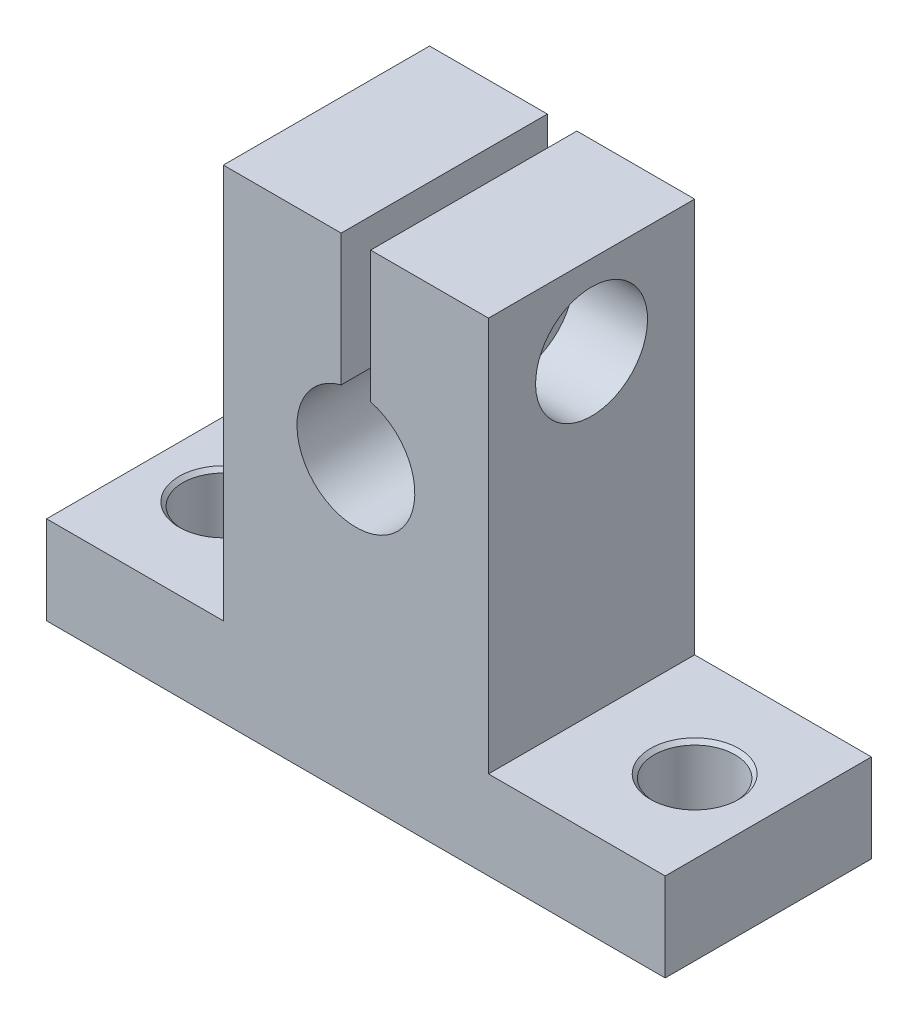
ISO-10303-21;
HEADER;
FILE_DESCRIPTION(('STEP AP214'),'2;1');
FILE_NAME('part.step','',(''),(''),'','','');
FILE_SCHEMA(('AUTOMOTIVE_DESIGN { 1 0 10303 214 1 1 1 1 }'));
ENDSEC;
DATA;
#1=APPLICATION_CONTEXT('core data for automotive mechanical design processes');
#2=APPLICATION_PROTOCOL_DEFINITION('international standard','automotive_design',2000,#1);
#3=PRODUCT_CONTEXT('',#1,'mechanical');
#4=PRODUCT('Part','Part','',(#3));
#5=PRODUCT_RELATED_PRODUCT_CATEGORY('part','',(#4));
#6=PRODUCT_DEFINITION_FORMATION('','',#4);
#7=PRODUCT_DEFINITION_CONTEXT('part definition',#1,'design');
#8=PRODUCT_DEFINITION('design','',#6,#7);
#9=PRODUCT_DEFINITION_SHAPE('','',#8);
#10=(LENGTH_UNIT() NAMED_UNIT(*) SI_UNIT(.MILLI.,.METRE.));
#11=(NAMED_UNIT(*) PLANE_ANGLE_UNIT() SI_UNIT($,.RADIAN.));
#12=(NAMED_UNIT(*) SI_UNIT($,.STERADIAN.) SOLID_ANGLE_UNIT());
#13=UNCERTAINTY_MEASURE_WITH_UNIT(LENGTH_MEASURE(1.E-05),#10,'distance_accuracy_value','');
#14=(GEOMETRIC_REPRESENTATION_CONTEXT(3) GLOBAL_UNCERTAINTY_ASSIGNED_CONTEXT((#13)) GLOBAL_UNIT_ASSIGNED_CONTEXT((#10,
#11,#12)) REPRESENTATION_CONTEXT('',''));
#15=CARTESIAN_POINT('',(0.,0.,0.));
#16=DIRECTION('',(0.,0.,1.));
#17=DIRECTION('',(1.,0.,0.));
#18=AXIS2_PLACEMENT_3D('',#15,#16,#17);
#19=CARTESIAN_POINT('',(-4.93969696196699,10.9364916731037,0.));
#20=DIRECTION('',(1.,0.,0.));
#21=DIRECTION('',(0.,1.,0.));
#22=AXIS2_PLACEMENT_3D('',#19,#20,#21);
#23=CYLINDRICAL_SURFACE('',#22,2.1);
#24=CARTESIAN_POINT('',(1.,10.9364916731037,0.));
#25=DIRECTION('',(1.,0.,0.));
#26=DIRECTION('',(0.,1.,0.));
#27=AXIS2_PLACEMENT_3D('',#24,#25,#26);
#28=CIRCLE('',#27,2.1);
#29=CARTESIAN_POINT('',(1.,13.0364916731037,0.));
#30=VERTEX_POINT('',#29);
#31=EDGE_CURVE('E212',#30,#30,#28,.F.);
#32=ORIENTED_EDGE('',*,*,#31,.T.);
#33=EDGE_LOOP('',(#32));
#34=FACE_BOUND('',#33,.T.);
#35=CARTESIAN_POINT('',(4.,10.9364916731037,0.));
#36=DIRECTION('',(1.,0.,0.));
#37=DIRECTION('',(0.,1.,0.));
#38=AXIS2_PLACEMENT_3D('',#35,#36,#37);
#39=CIRCLE('',#38,2.1);
#40=CARTESIAN_POINT('',(4.,13.0364916731037,0.));
#41=VERTEX_POINT('',#40);
#42=EDGE_CURVE('E209',#41,#41,#39,.F.);
#43=ORIENTED_EDGE('',*,*,#42,.F.);
#44=EDGE_LOOP('',(#43));
#45=FACE_BOUND('',#44,.T.);
#46=ADVANCED_FACE('F36',(#34,#45),#23,.F.);
#47=CARTESIAN_POINT('',(-9.,-10.4,7.));
#48=DIRECTION('',(1.,0.,0.));
#49=DIRECTION('',(0.,1.,0.));
#50=AXIS2_PLACEMENT_3D('',#47,#48,#49);
#51=PLANE('',#50);
#52=CARTESIAN_POINT('',(-9.,10.9364916731037,0.));
#53=DIRECTION('',(1.,0.,0.));
#54=DIRECTION('',(0.,1.,0.));
#55=AXIS2_PLACEMENT_3D('',#52,#53,#54);
#56=CIRCLE('',#55,1.9);
#57=CARTESIAN_POINT('',(-9.,12.8364916731037,0.));
#58=VERTEX_POINT('',#57);
#59=EDGE_CURVE('E11',#58,#58,#56,.T.);
#60=ORIENTED_EDGE('',*,*,#59,.T.);
#61=EDGE_LOOP('',(#60));
#62=FACE_BOUND('',#61,.T.);
#63=DIRECTION('',(0.,-1.,0.));
#64=VECTOR('',#63,1.);
#65=CARTESIAN_POINT('',(-9.,-10.4,-7.));
#66=LINE('',#65,#64);
#67=CARTESIAN_POINT('',(-9.,16.4,-7.));
#68=VERTEX_POINT('',#67);
#69=CARTESIAN_POINT('',(-9.,-10.4,-7.));
#70=VERTEX_POINT('',#69);
#71=EDGE_CURVE('E158',#68,#70,#66,.T.);
#72=ORIENTED_EDGE('',*,*,#71,.T.);
#73=DIRECTION('',(0.,0.,-1.));
#74=VECTOR('',#73,1.);
#75=CARTESIAN_POINT('',(-9.,-10.4,7.));
#76=LINE('',#75,#74);
#77=CARTESIAN_POINT('',(-9.,-10.4,7.));
#78=VERTEX_POINT('',#77);
#79=EDGE_CURVE('E206',#78,#70,#76,.T.);
#80=ORIENTED_EDGE('',*,*,#79,.F.);
#81=DIRECTION('',(0.,-1.,0.));
#82=VECTOR('',#81,1.);
#83=CARTESIAN_POINT('',(-9.,-10.4,7.));
#84=LINE('',#83,#82);
#85=CARTESIAN_POINT('',(-9.,16.4,7.));
#86=VERTEX_POINT('',#85);
#87=EDGE_CURVE('E181',#86,#78,#84,.T.);
#88=ORIENTED_EDGE('',*,*,#87,.F.);
#89=DIRECTION('',(0.,0.,-1.));
#90=VECTOR('',#89,1.);
#91=CARTESIAN_POINT('',(-9.,16.4,7.));
#92=LINE('',#91,#90);
#93=EDGE_CURVE('E154',#86,#68,#92,.T.);
#94=ORIENTED_EDGE('',*,*,#93,.T.);
#95=EDGE_LOOP('',(#72,#80,#88,#94));
#96=FACE_BOUND('',#95,.T.);
#97=ADVANCED_FACE('F240',(#62,#96),#51,.F.);
#98=CARTESIAN_POINT('',(-21.,-10.4,7.));
#99=DIRECTION('',(0.,-1.,0.));
#100=DIRECTION('',(0.,0.,-1.));
#101=AXIS2_PLACEMENT_3D('',#98,#99,#100);
#102=PLANE('',#101);
#103=CARTESIAN_POINT('',(-16.,-10.4,0.));
#104=DIRECTION('',(0.,-1.,0.));
#105=DIRECTION('',(0.,0.,-1.));
#106=AXIS2_PLACEMENT_3D('',#103,#104,#105);
#107=CIRCLE('',#106,3.00000000000003);
#108=CARTESIAN_POINT('',(-16.,-10.4,-3.00000000000003));
#109=VERTEX_POINT('',#108);
#110=EDGE_CURVE('E222',#109,#109,#107,.T.);
#111=ORIENTED_EDGE('',*,*,#110,.T.);
#112=EDGE_LOOP('',(#111));
#113=FACE_BOUND('',#112,.T.);
#114=DIRECTION('',(-1.,0.,0.));
#115=VECTOR('',#114,1.);
#116=CARTESIAN_POINT('',(-21.,-10.4,-7.));
#117=LINE('',#116,#115);
#118=CARTESIAN_POINT('',(-21.,-10.4,-7.));
#119=VERTEX_POINT('',#118);
#120=EDGE_CURVE('E161',#70,#119,#117,.T.);
#121=ORIENTED_EDGE('',*,*,#120,.T.);
#122=DIRECTION('',(0.,0.,-1.));
#123=VECTOR('',#122,1.);
#124=CARTESIAN_POINT('',(-21.,-10.4,7.));
#125=LINE('',#124,#123);
#126=CARTESIAN_POINT('',(-21.,-10.4,7.));
#127=VERTEX_POINT('',#126);
#128=EDGE_CURVE('E203',#127,#119,#125,.T.);
#129=ORIENTED_EDGE('',*,*,#128,.F.);
#130=DIRECTION('',(-1.,0.,0.));
#131=VECTOR('',#130,1.);
#132=CARTESIAN_POINT('',(-21.,-10.4,7.));
#133=LINE('',#132,#131);
#134=EDGE_CURVE('E109',#78,#127,#133,.T.);
#135=ORIENTED_EDGE('',*,*,#134,.F.);
#136=ORIENTED_EDGE('',*,*,#79,.T.);
#137=EDGE_LOOP('',(#121,#129,#135,#136));
#138=FACE_BOUND('',#137,.T.);
#139=ADVANCED_FACE('F246',(#113,#138),#102,.F.);
#140=CARTESIAN_POINT('',(-21.,-16.4,7.));
#141=DIRECTION('',(1.,0.,0.));
#142=DIRECTION('',(0.,0.,-1.));
#143=AXIS2_PLACEMENT_3D('',#140,#141,#142);
#144=PLANE('',#143);
#145=DIRECTION('',(0.,-1.,0.));
#146=VECTOR('',#145,1.);
#147=CARTESIAN_POINT('',(-21.,-16.4,-7.));
#148=LINE('',#147,#146);
#149=CARTESIAN_POINT('',(-21.,-16.4,-7.));
#150=VERTEX_POINT('',#149);
#151=EDGE_CURVE('E164',#119,#150,#148,.T.);
#152=ORIENTED_EDGE('',*,*,#151,.T.);
#153=DIRECTION('',(0.,0.,-1.));
#154=VECTOR('',#153,1.);
#155=CARTESIAN_POINT('',(-21.,-16.4,7.));
#156=LINE('',#155,#154);
#157=CARTESIAN_POINT('',(-21.,-16.4,7.));
#158=VERTEX_POINT('',#157);
#159=EDGE_CURVE('E200',#158,#150,#156,.T.);
#160=ORIENTED_EDGE('',*,*,#159,.F.);
#161=DIRECTION('',(0.,-1.,0.));
#162=VECTOR('',#161,1.);
#163=CARTESIAN_POINT('',(-21.,-16.4,7.));
#164=LINE('',#163,#162);
#165=EDGE_CURVE('E334',#127,#158,#164,.T.);
#166=ORIENTED_EDGE('',*,*,#165,.F.);
#167=ORIENTED_EDGE('',*,*,#128,.T.);
#168=EDGE_LOOP('',(#152,#160,#166,#167));
#169=FACE_BOUND('',#168,.T.);
#170=ADVANCED_FACE('F303',(#169),#144,.F.);
#171=CARTESIAN_POINT('',(21.,-16.4,7.));
#172=DIRECTION('',(0.,1.,0.));
#173=DIRECTION('',(-1.,0.,0.));
#174=AXIS2_PLACEMENT_3D('',#171,#172,#173);
#175=PLANE('',#174);
#176=CARTESIAN_POINT('',(16.,-16.4,0.));
#177=DIRECTION('',(0.,1.,0.));
#178=DIRECTION('',(-1.,0.,0.));
#179=AXIS2_PLACEMENT_3D('',#176,#177,#178);
#180=CIRCLE('',#179,2.75);
#181=CARTESIAN_POINT('',(13.25,-16.4,0.));
#182=VERTEX_POINT('',#181);
#183=EDGE_CURVE('E323',#182,#182,#180,.F.);
#184=ORIENTED_EDGE('',*,*,#183,.F.);
#185=EDGE_LOOP('',(#184));
#186=FACE_BOUND('',#185,.T.);
#187=CARTESIAN_POINT('',(-16.,-16.4,0.));
#188=DIRECTION('',(0.,1.,0.));
#189=DIRECTION('',(-1.,0.,0.));
#190=AXIS2_PLACEMENT_3D('',#187,#188,#189);
#191=CIRCLE('',#190,2.75);
#192=CARTESIAN_POINT('',(-18.75,-16.4,0.));
#193=VERTEX_POINT('',#192);
#194=EDGE_CURVE('E162',#193,#193,#191,.F.);
#195=ORIENTED_EDGE('',*,*,#194,.F.);
#196=EDGE_LOOP('',(#195));
#197=FACE_BOUND('',#196,.T.);
#198=DIRECTION('',(1.,0.,0.));
#199=VECTOR('',#198,1.);
#200=CARTESIAN_POINT('',(21.,-16.4,-7.));
#201=LINE('',#200,#199);
#202=CARTESIAN_POINT('',(21.,-16.4,-7.));
#203=VERTEX_POINT('',#202);
#204=EDGE_CURVE('E166',#150,#203,#201,.T.);
#205=ORIENTED_EDGE('',*,*,#204,.T.);
#206=DIRECTION('',(0.,0.,-1.));
#207=VECTOR('',#206,1.);
#208=CARTESIAN_POINT('',(21.,-16.4,7.));
#209=LINE('',#208,#207);
#210=CARTESIAN_POINT('',(21.,-16.4,7.));
#211=VERTEX_POINT('',#210);
#212=EDGE_CURVE('E197',#211,#203,#209,.T.);
#213=ORIENTED_EDGE('',*,*,#212,.F.);
#214=DIRECTION('',(1.,0.,0.));
#215=VECTOR('',#214,1.);
#216=CARTESIAN_POINT('',(21.,-16.4,7.));
#217=LINE('',#216,#215);
#218=EDGE_CURVE('E336',#158,#211,#217,.T.);
#219=ORIENTED_EDGE('',*,*,#218,.F.);
#220=ORIENTED_EDGE('',*,*,#159,.T.);
#221=EDGE_LOOP('',(#205,#213,#219,#220));
#222=FACE_BOUND('',#221,.T.);
#223=ADVANCED_FACE('F299',(#186,#197,#222),#175,.F.);
#224=CARTESIAN_POINT('',(21.,-10.4,7.));
#225=DIRECTION('',(-1.,0.,0.));
#226=DIRECTION('',(0.,0.,1.));
#227=AXIS2_PLACEMENT_3D('',#224,#225,#226);
#228=PLANE('',#227);
#229=DIRECTION('',(0.,1.,0.));
#230=VECTOR('',#229,1.);
#231=CARTESIAN_POINT('',(21.,-10.4,-7.));
#232=LINE('',#231,#230);
#233=CARTESIAN_POINT('',(21.,-10.4,-7.));
#234=VERTEX_POINT('',#233);
#235=EDGE_CURVE('E168',#203,#234,#232,.T.);
#236=ORIENTED_EDGE('',*,*,#235,.T.);
#237=DIRECTION('',(0.,0.,-1.));
#238=VECTOR('',#237,1.);
#239=CARTESIAN_POINT('',(21.,-10.4,7.));
#240=LINE('',#239,#238);
#241=CARTESIAN_POINT('',(21.,-10.4,7.));
#242=VERTEX_POINT('',#241);
#243=EDGE_CURVE('E194',#242,#234,#240,.T.);
#244=ORIENTED_EDGE('',*,*,#243,.F.);
#245=DIRECTION('',(0.,1.,0.));
#246=VECTOR('',#245,1.);
#247=CARTESIAN_POINT('',(21.,-10.4,7.));
#248=LINE('',#247,#246);
#249=EDGE_CURVE('E338',#211,#242,#248,.T.);
#250=ORIENTED_EDGE('',*,*,#249,.F.);
#251=ORIENTED_EDGE('',*,*,#212,.T.);
#252=EDGE_LOOP('',(#236,#244,#250,#251));
#253=FACE_BOUND('',#252,.T.);
#254=ADVANCED_FACE('F295',(#253),#228,.F.);
#255=CARTESIAN_POINT('',(9.,-10.4,7.));
#256=DIRECTION('',(0.,-1.,0.));
#257=DIRECTION('',(1.,0.,0.));
#258=AXIS2_PLACEMENT_3D('',#255,#256,#257);
#259=PLANE('',#258);
#260=CARTESIAN_POINT('',(16.,-10.4,0.));
#261=DIRECTION('',(0.,-1.,0.));
#262=DIRECTION('',(1.,0.,0.));
#263=AXIS2_PLACEMENT_3D('',#260,#261,#262);
#264=CIRCLE('',#263,3.00000000000004);
#265=CARTESIAN_POINT('',(19.,-10.4,0.));
#266=VERTEX_POINT('',#265);
#267=EDGE_CURVE('E216',#266,#266,#264,.T.);
#268=ORIENTED_EDGE('',*,*,#267,.T.);
#269=EDGE_LOOP('',(#268));
#270=FACE_BOUND('',#269,.T.);
#271=DIRECTION('',(-1.,0.,0.));
#272=VECTOR('',#271,1.);
#273=CARTESIAN_POINT('',(9.,-10.4,-7.));
#274=LINE('',#273,#272);
#275=CARTESIAN_POINT('',(9.,-10.4,-7.));
#276=VERTEX_POINT('',#275);
#277=EDGE_CURVE('E170',#234,#276,#274,.T.);
#278=ORIENTED_EDGE('',*,*,#277,.T.);
#279=DIRECTION('',(0.,0.,-1.));
#280=VECTOR('',#279,1.);
#281=CARTESIAN_POINT('',(9.,-10.4,7.));
#282=LINE('',#281,#280);
#283=CARTESIAN_POINT('',(9.,-10.4,7.));
#284=VERTEX_POINT('',#283);
#285=EDGE_CURVE('E191',#284,#276,#282,.T.);
#286=ORIENTED_EDGE('',*,*,#285,.F.);
#287=DIRECTION('',(-1.,0.,0.));
#288=VECTOR('',#287,1.);
#289=CARTESIAN_POINT('',(9.,-10.4,7.));
#290=LINE('',#289,#288);
#291=EDGE_CURVE('E340',#242,#284,#290,.T.);
#292=ORIENTED_EDGE('',*,*,#291,.F.);
#293=ORIENTED_EDGE('',*,*,#243,.T.);
#294=EDGE_LOOP('',(#278,#286,#292,#293));
#295=FACE_BOUND('',#294,.T.);
#296=ADVANCED_FACE('F291',(#270,#295),#259,.F.);
#297=CARTESIAN_POINT('',(9.,16.4,7.));
#298=DIRECTION('',(-1.,0.,0.));
#299=DIRECTION('',(0.,-1.,0.));
#300=AXIS2_PLACEMENT_3D('',#297,#298,#299);
#301=PLANE('',#300);
#302=CARTESIAN_POINT('',(9.,10.9364916731037,0.));
#303=DIRECTION('',(1.,0.,0.));
#304=DIRECTION('',(0.,1.,0.));
#305=AXIS2_PLACEMENT_3D('',#302,#303,#304);
#306=CIRCLE('',#305,3.8);
#307=CARTESIAN_POINT('',(9.,14.7364916731037,0.));
#308=VERTEX_POINT('',#307);
#309=EDGE_CURVE('E373',#308,#308,#306,.T.);
#310=ORIENTED_EDGE('',*,*,#309,.F.);
#311=EDGE_LOOP('',(#310));
#312=FACE_BOUND('',#311,.T.);
#313=DIRECTION('',(0.,1.,0.));
#314=VECTOR('',#313,1.);
#315=CARTESIAN_POINT('',(9.,16.4,-7.));
#316=LINE('',#315,#314);
#317=CARTESIAN_POINT('',(9.,16.4,-7.));
#318=VERTEX_POINT('',#317);
#319=EDGE_CURVE('E172',#276,#318,#316,.T.);
#320=ORIENTED_EDGE('',*,*,#319,.T.);
#321=DIRECTION('',(0.,0.,-1.));
#322=VECTOR('',#321,1.);
#323=CARTESIAN_POINT('',(9.,16.4,7.));
#324=LINE('',#323,#322);
#325=CARTESIAN_POINT('',(9.,16.4,7.));
#326=VERTEX_POINT('',#325);
#327=EDGE_CURVE('E188',#326,#318,#324,.T.);
#328=ORIENTED_EDGE('',*,*,#327,.F.);
#329=DIRECTION('',(0.,1.,0.));
#330=VECTOR('',#329,1.);
#331=CARTESIAN_POINT('',(9.,16.4,7.));
#332=LINE('',#331,#330);
#333=EDGE_CURVE('E342',#284,#326,#332,.T.);
#334=ORIENTED_EDGE('',*,*,#333,.F.);
#335=ORIENTED_EDGE('',*,*,#285,.T.);
#336=EDGE_LOOP('',(#320,#328,#334,#335));
#337=FACE_BOUND('',#336,.T.);
#338=ADVANCED_FACE('F287',(#312,#337),#301,.F.);
#339=CARTESIAN_POINT('',(0.999999999999999,16.4,7.));
#340=DIRECTION('',(0.,-1.,0.));
#341=DIRECTION('',(1.,0.,0.));
#342=AXIS2_PLACEMENT_3D('',#339,#340,#341);
#343=PLANE('',#342);
#344=DIRECTION('',(-1.,0.,0.));
#345=VECTOR('',#344,1.);
#346=CARTESIAN_POINT('',(0.999999999999999,16.4,-7.));
#347=LINE('',#346,#345);
#348=CARTESIAN_POINT('',(0.999999999999999,16.4,-7.));
#349=VERTEX_POINT('',#348);
#350=EDGE_CURVE('E174',#318,#349,#347,.T.);
#351=ORIENTED_EDGE('',*,*,#350,.T.);
#352=DIRECTION('',(0.,0.,-1.));
#353=VECTOR('',#352,1.);
#354=CARTESIAN_POINT('',(0.999999999999999,16.4,7.));
#355=LINE('',#354,#353);
#356=CARTESIAN_POINT('',(0.999999999999999,16.4,7.));
#357=VERTEX_POINT('',#356);
#358=EDGE_CURVE('E185',#357,#349,#355,.T.);
#359=ORIENTED_EDGE('',*,*,#358,.F.);
#360=DIRECTION('',(-1.,0.,0.));
#361=VECTOR('',#360,1.);
#362=CARTESIAN_POINT('',(0.999999999999999,16.4,7.));
#363=LINE('',#362,#361);
#364=EDGE_CURVE('E344',#326,#357,#363,.T.);
#365=ORIENTED_EDGE('',*,*,#364,.F.);
#366=ORIENTED_EDGE('',*,*,#327,.T.);
#367=EDGE_LOOP('',(#351,#359,#365,#366));
#368=FACE_BOUND('',#367,.T.);
#369=ADVANCED_FACE('F283',(#368),#343,.F.);
#370=CARTESIAN_POINT('',(1.,7.47298334620742,7.));
#371=DIRECTION('',(1.,0.,0.));
#372=DIRECTION('',(0.,1.,0.));
#373=AXIS2_PLACEMENT_3D('',#370,#371,#372);
#374=PLANE('',#373);
#375=ORIENTED_EDGE('',*,*,#31,.F.);
#376=EDGE_LOOP('',(#375));
#377=FACE_BOUND('',#376,.T.);
#378=DIRECTION('',(0.,-1.,0.));
#379=VECTOR('',#378,1.);
#380=CARTESIAN_POINT('',(1.,7.47298334620742,-7.));
#381=LINE('',#380,#379);
#382=CARTESIAN_POINT('',(1.,7.47298334620742,-7.));
#383=VERTEX_POINT('',#382);
#384=EDGE_CURVE('E176',#349,#383,#381,.T.);
#385=ORIENTED_EDGE('',*,*,#384,.T.);
#386=DIRECTION('',(0.,0.,-1.));
#387=VECTOR('',#386,1.);
#388=CARTESIAN_POINT('',(1.,7.47298334620742,7.));
#389=LINE('',#388,#387);
#390=CARTESIAN_POINT('',(1.,7.47298334620742,7.));
#391=VERTEX_POINT('',#390);
#392=EDGE_CURVE('E149',#391,#383,#389,.T.);
#393=ORIENTED_EDGE('',*,*,#392,.F.);
#394=DIRECTION('',(0.,-1.,0.));
#395=VECTOR('',#394,1.);
#396=CARTESIAN_POINT('',(1.,7.47298334620742,7.));
#397=LINE('',#396,#395);
#398=EDGE_CURVE('E140',#357,#391,#397,.T.);
#399=ORIENTED_EDGE('',*,*,#398,.F.);
#400=ORIENTED_EDGE('',*,*,#358,.T.);
#401=EDGE_LOOP('',(#385,#393,#399,#400));
#402=FACE_BOUND('',#401,.T.);
#403=ADVANCED_FACE('F280',(#377,#402),#374,.F.);
#404=CARTESIAN_POINT('',(0.,3.6,7.));
#405=DIRECTION('',(0.,0.,-1.));
#406=DIRECTION('',(-1.,0.,0.));
#407=AXIS2_PLACEMENT_3D('',#404,#405,#406);
#408=CYLINDRICAL_SURFACE('',#407,4.);
#409=CARTESIAN_POINT('',(0.,3.6,-7.));
#410=DIRECTION('',(0.,0.,-1.));
#411=DIRECTION('',(1.,0.,0.));
#412=AXIS2_PLACEMENT_3D('',#409,#410,#411);
#413=CIRCLE('',#412,4.);
#414=CARTESIAN_POINT('',(-0.999999999999999,7.47298334620742,-7.));
#415=VERTEX_POINT('',#414);
#416=EDGE_CURVE('E148',#383,#415,#413,.T.);
#417=ORIENTED_EDGE('',*,*,#416,.T.);
#418=DIRECTION('',(0.,0.,-1.));
#419=VECTOR('',#418,1.);
#420=CARTESIAN_POINT('',(-0.999999999999999,7.47298334620742,7.));
#421=LINE('',#420,#419);
#422=CARTESIAN_POINT('',(-0.999999999999999,7.47298334620742,7.));
#423=VERTEX_POINT('',#422);
#424=EDGE_CURVE('E145',#423,#415,#421,.T.);
#425=ORIENTED_EDGE('',*,*,#424,.F.);
#426=CARTESIAN_POINT('',(0.,3.6,7.));
#427=DIRECTION('',(0.,0.,-1.));
#428=DIRECTION('',(1.,0.,0.));
#429=AXIS2_PLACEMENT_3D('',#426,#427,#428);
#430=CIRCLE('',#429,4.);
#431=EDGE_CURVE('E134',#391,#423,#430,.T.);
#432=ORIENTED_EDGE('',*,*,#431,.F.);
#433=ORIENTED_EDGE('',*,*,#392,.T.);
#434=EDGE_LOOP('',(#417,#425,#432,#433));
#435=FACE_BOUND('',#434,.T.);
#436=ADVANCED_FACE('F146',(#435),#408,.F.);
#437=CARTESIAN_POINT('',(-1.,16.4,7.));
#438=DIRECTION('',(-1.,0.,0.));
#439=DIRECTION('',(0.,-1.,0.));
#440=AXIS2_PLACEMENT_3D('',#437,#438,#439);
#441=PLANE('',#440);
#442=CARTESIAN_POINT('',(-0.999999999999998,10.9364916731037,0.));
#443=DIRECTION('',(1.,0.,0.));
#444=DIRECTION('',(0.,0.,-1.));
#445=AXIS2_PLACEMENT_3D('',#442,#443,#444);
#446=CIRCLE('',#445,1.65);
#447=CARTESIAN_POINT('',(-0.999999999999998,10.9364916731037,-1.65));
#448=VERTEX_POINT('',#447);
#449=EDGE_CURVE('E324',#448,#448,#446,.T.);
#450=ORIENTED_EDGE('',*,*,#449,.F.);
#451=EDGE_LOOP('',(#450));
#452=FACE_BOUND('',#451,.T.);
#453=DIRECTION('',(0.,1.,0.));
#454=VECTOR('',#453,1.);
#455=CARTESIAN_POINT('',(-1.,16.4,-7.));
#456=LINE('',#455,#454);
#457=CARTESIAN_POINT('',(-1.,16.4,-7.));
#458=VERTEX_POINT('',#457);
#459=EDGE_CURVE('E94',#415,#458,#456,.T.);
#460=ORIENTED_EDGE('',*,*,#459,.T.);
#461=DIRECTION('',(0.,0.,-1.));
#462=VECTOR('',#461,1.);
#463=CARTESIAN_POINT('',(-1.,16.4,7.));
#464=LINE('',#463,#462);
#465=CARTESIAN_POINT('',(-1.,16.4,7.));
#466=VERTEX_POINT('',#465);
#467=EDGE_CURVE('E150',#466,#458,#464,.T.);
#468=ORIENTED_EDGE('',*,*,#467,.F.);
#469=DIRECTION('',(0.,1.,0.));
#470=VECTOR('',#469,1.);
#471=CARTESIAN_POINT('',(-1.,16.4,7.));
#472=LINE('',#471,#470);
#473=EDGE_CURVE('E138',#423,#466,#472,.T.);
#474=ORIENTED_EDGE('',*,*,#473,.F.);
#475=ORIENTED_EDGE('',*,*,#424,.T.);
#476=EDGE_LOOP('',(#460,#468,#474,#475));
#477=FACE_BOUND('',#476,.T.);
#478=ADVANCED_FACE('F152',(#452,#477),#441,.F.);
#479=CARTESIAN_POINT('',(-9.,16.4,7.));
#480=DIRECTION('',(0.,-1.,0.));
#481=DIRECTION('',(0.,0.,-1.));
#482=AXIS2_PLACEMENT_3D('',#479,#480,#481);
#483=PLANE('',#482);
#484=DIRECTION('',(-1.,0.,0.));
#485=VECTOR('',#484,1.);
#486=CARTESIAN_POINT('',(-9.,16.4,-7.));
#487=LINE('',#486,#485);
#488=EDGE_CURVE('E100',#458,#68,#487,.T.);
#489=ORIENTED_EDGE('',*,*,#488,.T.);
#490=ORIENTED_EDGE('',*,*,#93,.F.);
#491=DIRECTION('',(-1.,0.,0.));
#492=VECTOR('',#491,1.);
#493=CARTESIAN_POINT('',(-9.,16.4,7.));
#494=LINE('',#493,#492);
#495=EDGE_CURVE('E53',#466,#86,#494,.T.);
#496=ORIENTED_EDGE('',*,*,#495,.F.);
#497=ORIENTED_EDGE('',*,*,#467,.T.);
#498=EDGE_LOOP('',(#489,#490,#496,#497));
#499=FACE_BOUND('',#498,.T.);
#500=ADVANCED_FACE('F269',(#499),#483,.F.);
#501=CARTESIAN_POINT('',(0.,3.6,7.));
#502=DIRECTION('',(0.,0.,1.));
#503=DIRECTION('',(1.,0.,0.));
#504=AXIS2_PLACEMENT_3D('',#501,#502,#503);
#505=PLANE('',#504);
#506=ORIENTED_EDGE('',*,*,#87,.T.);
#507=ORIENTED_EDGE('',*,*,#134,.T.);
#508=ORIENTED_EDGE('',*,*,#165,.T.);
#509=ORIENTED_EDGE('',*,*,#218,.T.);
#510=ORIENTED_EDGE('',*,*,#249,.T.);
#511=ORIENTED_EDGE('',*,*,#291,.T.);
#512=ORIENTED_EDGE('',*,*,#333,.T.);
#513=ORIENTED_EDGE('',*,*,#364,.T.);
#514=ORIENTED_EDGE('',*,*,#398,.T.);
#515=ORIENTED_EDGE('',*,*,#431,.T.);
#516=ORIENTED_EDGE('',*,*,#473,.T.);
#517=ORIENTED_EDGE('',*,*,#495,.T.);
#518=EDGE_LOOP('',(#506,#507,#508,#509,#510,#511,#512,#513,#514,#515,#516,#517));
#519=FACE_BOUND('',#518,.T.);
#520=ADVANCED_FACE('F136',(#519),#505,.T.);
#521=CARTESIAN_POINT('',(0.,3.6,-7.));
#522=DIRECTION('',(0.,0.,1.));
#523=DIRECTION('',(1.,0.,0.));
#524=AXIS2_PLACEMENT_3D('',#521,#522,#523);
#525=PLANE('',#524);
#526=ORIENTED_EDGE('',*,*,#71,.F.);
#527=ORIENTED_EDGE('',*,*,#488,.F.);
#528=ORIENTED_EDGE('',*,*,#459,.F.);
#529=ORIENTED_EDGE('',*,*,#416,.F.);
#530=ORIENTED_EDGE('',*,*,#384,.F.);
#531=ORIENTED_EDGE('',*,*,#350,.F.);
#532=ORIENTED_EDGE('',*,*,#319,.F.);
#533=ORIENTED_EDGE('',*,*,#277,.F.);
#534=ORIENTED_EDGE('',*,*,#235,.F.);
#535=ORIENTED_EDGE('',*,*,#204,.F.);
#536=ORIENTED_EDGE('',*,*,#151,.F.);
#537=ORIENTED_EDGE('',*,*,#120,.F.);
#538=EDGE_LOOP('',(#526,#527,#528,#529,#530,#531,#532,#533,#534,#535,#536,#537));
#539=FACE_BOUND('',#538,.T.);
#540=ADVANCED_FACE('F265',(#539),#525,.F.);
#541=CARTESIAN_POINT('',(-16.,-24.178174593052,0.));
#542=DIRECTION('',(0.,1.,0.));
#543=DIRECTION('',(-1.,0.,0.));
#544=AXIS2_PLACEMENT_3D('',#541,#542,#543);
#545=CYLINDRICAL_SURFACE('',#544,2.75);
#546=CARTESIAN_POINT('',(-16.,-10.65,0.));
#547=DIRECTION('',(0.,-1.,0.));
#548=DIRECTION('',(0.,0.,-1.));
#549=AXIS2_PLACEMENT_3D('',#546,#547,#548);
#550=CIRCLE('',#549,2.75);
#551=CARTESIAN_POINT('',(-18.75,-10.65,0.));
#552=VERTEX_POINT('',#551);
#553=EDGE_CURVE('E219',#552,#552,#550,.F.);
#554=CARTESIAN_POINT('',(-18.75,-10.65,0.));
#555=CARTESIAN_POINT('',(-18.75,-10.7098958333334,0.));
#556=CARTESIAN_POINT('',(-18.75,-10.7697916666667,0.));
#557=CARTESIAN_POINT('',(-18.75,-10.8895833333334,0.));
#558=CARTESIAN_POINT('',(-18.75,-10.9494791666667,0.));
#559=CARTESIAN_POINT('',(-18.75,-11.0692708333334,0.));
#560=CARTESIAN_POINT('',(-18.75,-11.1291666666667,0.));
#561=CARTESIAN_POINT('',(-18.75,-11.2489583333334,0.));
#562=CARTESIAN_POINT('',(-18.75,-11.3088541666667,0.));
#563=CARTESIAN_POINT('',(-18.75,-11.4286458333334,0.));
#564=CARTESIAN_POINT('',(-18.75,-11.4885416666667,0.));
#565=CARTESIAN_POINT('',(-18.75,-11.6083333333334,0.));
#566=CARTESIAN_POINT('',(-18.75,-11.6682291666667,0.));
#567=CARTESIAN_POINT('',(-18.75,-11.7880208333334,0.));
#568=CARTESIAN_POINT('',(-18.75,-11.8479166666667,0.));
#569=CARTESIAN_POINT('',(-18.75,-11.9677083333334,0.));
#570=CARTESIAN_POINT('',(-18.75,-12.0276041666667,0.));
#571=CARTESIAN_POINT('',(-18.75,-12.1473958333334,0.));
#572=CARTESIAN_POINT('',(-18.75,-12.2072916666667,0.));
#573=CARTESIAN_POINT('',(-18.75,-12.3270833333334,0.));
#574=CARTESIAN_POINT('',(-18.75,-12.3869791666667,0.));
#575=CARTESIAN_POINT('',(-18.75,-12.5067708333334,0.));
#576=CARTESIAN_POINT('',(-18.75,-12.5666666666667,0.));
#577=CARTESIAN_POINT('',(-18.75,-12.6864583333334,0.));
#578=CARTESIAN_POINT('',(-18.75,-12.7463541666667,0.));
#579=CARTESIAN_POINT('',(-18.75,-12.8661458333334,0.));
#580=CARTESIAN_POINT('',(-18.75,-12.9260416666667,0.));
#581=CARTESIAN_POINT('',(-18.75,-13.0458333333334,0.));
#582=CARTESIAN_POINT('',(-18.75,-13.1057291666667,0.));
#583=CARTESIAN_POINT('',(-18.75,-13.2255208333334,0.));
#584=CARTESIAN_POINT('',(-18.75,-13.2854166666667,0.));
#585=CARTESIAN_POINT('',(-18.75,-13.4052083333334,0.));
#586=CARTESIAN_POINT('',(-18.75,-13.4651041666667,0.));
#587=CARTESIAN_POINT('',(-18.75,-13.5848958333334,0.));
#588=CARTESIAN_POINT('',(-18.75,-13.6447916666667,0.));
#589=CARTESIAN_POINT('',(-18.75,-13.7645833333334,0.));
#590=CARTESIAN_POINT('',(-18.75,-13.8244791666667,0.));
#591=CARTESIAN_POINT('',(-18.75,-13.9442708333334,0.));
#592=CARTESIAN_POINT('',(-18.75,-14.0041666666667,0.));
#593=CARTESIAN_POINT('',(-18.75,-14.1239583333334,0.));
#594=CARTESIAN_POINT('',(-18.75,-14.1838541666667,0.));
#595=CARTESIAN_POINT('',(-18.75,-14.3036458333334,0.));
#596=CARTESIAN_POINT('',(-18.75,-14.3635416666667,0.));
#597=CARTESIAN_POINT('',(-18.75,-14.4833333333334,0.));
#598=CARTESIAN_POINT('',(-18.75,-14.5432291666667,0.));
#599=CARTESIAN_POINT('',(-18.75,-14.6630208333334,0.));
#600=CARTESIAN_POINT('',(-18.75,-14.7229166666667,0.));
#601=CARTESIAN_POINT('',(-18.75,-14.8427083333334,0.));
#602=CARTESIAN_POINT('',(-18.75,-14.9026041666667,0.));
#603=CARTESIAN_POINT('',(-18.75,-15.0223958333333,0.));
#604=CARTESIAN_POINT('',(-18.75,-15.0822916666667,0.));
#605=CARTESIAN_POINT('',(-18.75,-15.2020833333333,0.));
#606=CARTESIAN_POINT('',(-18.75,-15.2619791666667,0.));
#607=CARTESIAN_POINT('',(-18.75,-15.3817708333333,0.));
#608=CARTESIAN_POINT('',(-18.75,-15.4416666666667,0.));
#609=CARTESIAN_POINT('',(-18.75,-15.5614583333333,0.));
#610=CARTESIAN_POINT('',(-18.75,-15.6213541666667,0.));
#611=CARTESIAN_POINT('',(-18.75,-15.7411458333333,0.));
#612=CARTESIAN_POINT('',(-18.75,-15.8010416666667,0.));
#613=CARTESIAN_POINT('',(-18.75,-15.9208333333333,0.));
#614=CARTESIAN_POINT('',(-18.75,-15.9807291666667,0.));
#615=CARTESIAN_POINT('',(-18.75,-16.1005208333333,0.));
#616=CARTESIAN_POINT('',(-18.75,-16.1604166666667,0.));
#617=CARTESIAN_POINT('',(-18.75,-16.2802083333333,0.));
#618=CARTESIAN_POINT('',(-18.75,-16.3401041666667,0.));
#619=CARTESIAN_POINT('',(-18.75,-16.4,0.));
#620=B_SPLINE_CURVE_WITH_KNOTS('',3,(#554,#555,#556,#557,#558,#559,#560,#561,#562,#563,#564,
#565,#566,#567,#568,#569,#570,#571,#572,#573,#574,#575,#576,#577,#578,#579,#580,#581,#582,#583,
#584,#585,#586,#587,#588,#589,#590,#591,#592,#593,#594,#595,#596,#597,#598,#599,#600,#601,#602,
#603,#604,#605,#606,#607,#608,#609,#610,#611,#612,#613,#614,#615,#616,#617,#618,#619),
.UNSPECIFIED.,.F.,.F.,(4,2,2,2,2,2,2,2,2,2,2,2,2,2,2,2,2,2,2,2,2,2,2,2,2,2,2,2,2,2,2,2,4),(0.,
0.179687499999999,0.359374999999999,0.539062499999998,0.718749999999997,0.898437499999995,
1.078125,1.25781249999999,1.43749999999999,1.61718749999999,1.79687499999999,1.97656249999999,
2.15624999999999,2.33593749999999,2.51562499999999,2.69531249999999,2.87499999999999,
3.05468749999999,3.23437499999998,3.41406249999998,3.59374999999998,3.77343749999998,
3.95312499999998,4.13281249999998,4.31249999999998,4.49218749999998,4.67187499999998,
4.85156249999998,5.03124999999998,5.21093749999998,5.39062499999997,5.57031249999997,
5.74999999999997),.UNSPECIFIED.);
#621=EDGE_CURVE('BSEAM261',#552,#193,#620,.T.);
#622=ORIENTED_EDGE('',*,*,#553,.T.);
#623=ORIENTED_EDGE('',*,*,#194,.T.);
#624=ORIENTED_EDGE('',*,*,#621,.T.);
#625=ORIENTED_EDGE('',*,*,#621,.F.);
#626=EDGE_LOOP('',(#622,#624,#623,#625));
#627=FACE_BOUND('',#626,.T.);
#628=ADVANCED_FACE('F261',(#627),#545,.F.);
#629=CARTESIAN_POINT('',(16.,-24.178174593052,0.));
#630=DIRECTION('',(0.,1.,0.));
#631=DIRECTION('',(-1.,0.,0.));
#632=AXIS2_PLACEMENT_3D('',#629,#630,#631);
#633=CYLINDRICAL_SURFACE('',#632,2.75);
#634=CARTESIAN_POINT('',(16.,-10.65,0.));
#635=DIRECTION('',(0.,-1.,0.));
#636=DIRECTION('',(0.,0.,-1.));
#637=AXIS2_PLACEMENT_3D('',#634,#635,#636);
#638=CIRCLE('',#637,2.75);
#639=CARTESIAN_POINT('',(13.25,-10.65,0.));
#640=VERTEX_POINT('',#639);
#641=EDGE_CURVE('E208',#640,#640,#638,.F.);
#642=CARTESIAN_POINT('',(13.25,-10.65,0.));
#643=CARTESIAN_POINT('',(13.25,-10.7098958333334,0.));
#644=CARTESIAN_POINT('',(13.25,-10.7697916666667,0.));
#645=CARTESIAN_POINT('',(13.25,-10.8895833333334,0.));
#646=CARTESIAN_POINT('',(13.25,-10.9494791666667,0.));
#647=CARTESIAN_POINT('',(13.25,-11.0692708333334,0.));
#648=CARTESIAN_POINT('',(13.25,-11.1291666666667,0.));
#649=CARTESIAN_POINT('',(13.25,-11.2489583333334,0.));
#650=CARTESIAN_POINT('',(13.25,-11.3088541666667,0.));
#651=CARTESIAN_POINT('',(13.25,-11.4286458333334,0.));
#652=CARTESIAN_POINT('',(13.25,-11.4885416666667,0.));
#653=CARTESIAN_POINT('',(13.25,-11.6083333333334,0.));
#654=CARTESIAN_POINT('',(13.25,-11.6682291666667,0.));
#655=CARTESIAN_POINT('',(13.25,-11.7880208333334,0.));
#656=CARTESIAN_POINT('',(13.25,-11.8479166666667,0.));
#657=CARTESIAN_POINT('',(13.25,-11.9677083333334,0.));
#658=CARTESIAN_POINT('',(13.25,-12.0276041666667,0.));
#659=CARTESIAN_POINT('',(13.25,-12.1473958333334,0.));
#660=CARTESIAN_POINT('',(13.25,-12.2072916666667,0.));
#661=CARTESIAN_POINT('',(13.25,-12.3270833333334,0.));
#662=CARTESIAN_POINT('',(13.25,-12.3869791666667,0.));
#663=CARTESIAN_POINT('',(13.25,-12.5067708333334,0.));
#664=CARTESIAN_POINT('',(13.25,-12.5666666666667,0.));
#665=CARTESIAN_POINT('',(13.25,-12.6864583333334,0.));
#666=CARTESIAN_POINT('',(13.25,-12.7463541666667,0.));
#667=CARTESIAN_POINT('',(13.25,-12.8661458333334,0.));
#668=CARTESIAN_POINT('',(13.25,-12.9260416666667,0.));
#669=CARTESIAN_POINT('',(13.25,-13.0458333333334,0.));
#670=CARTESIAN_POINT('',(13.25,-13.1057291666667,0.));
#671=CARTESIAN_POINT('',(13.25,-13.2255208333334,0.));
#672=CARTESIAN_POINT('',(13.25,-13.2854166666667,0.));
#673=CARTESIAN_POINT('',(13.25,-13.4052083333334,0.));
#674=CARTESIAN_POINT('',(13.25,-13.4651041666667,0.));
#675=CARTESIAN_POINT('',(13.25,-13.5848958333334,0.));
#676=CARTESIAN_POINT('',(13.25,-13.6447916666667,0.));
#677=CARTESIAN_POINT('',(13.25,-13.7645833333334,0.));
#678=CARTESIAN_POINT('',(13.25,-13.8244791666667,0.));
#679=CARTESIAN_POINT('',(13.25,-13.9442708333334,0.));
#680=CARTESIAN_POINT('',(13.25,-14.0041666666667,0.));
#681=CARTESIAN_POINT('',(13.25,-14.1239583333334,0.));
#682=CARTESIAN_POINT('',(13.25,-14.1838541666667,0.));
#683=CARTESIAN_POINT('',(13.25,-14.3036458333334,0.));
#684=CARTESIAN_POINT('',(13.25,-14.3635416666667,0.));
#685=CARTESIAN_POINT('',(13.25,-14.4833333333334,0.));
#686=CARTESIAN_POINT('',(13.25,-14.5432291666667,0.));
#687=CARTESIAN_POINT('',(13.25,-14.6630208333333,0.));
#688=CARTESIAN_POINT('',(13.25,-14.7229166666667,0.));
#689=CARTESIAN_POINT('',(13.25,-14.8427083333333,0.));
#690=CARTESIAN_POINT('',(13.25,-14.9026041666667,0.));
#691=CARTESIAN_POINT('',(13.25,-15.0223958333333,0.));
#692=CARTESIAN_POINT('',(13.25,-15.0822916666667,0.));
#693=CARTESIAN_POINT('',(13.25,-15.2020833333333,0.));
#694=CARTESIAN_POINT('',(13.25,-15.2619791666667,0.));
#695=CARTESIAN_POINT('',(13.25,-15.3817708333333,0.));
#696=CARTESIAN_POINT('',(13.25,-15.4416666666667,0.));
#697=CARTESIAN_POINT('',(13.25,-15.5614583333333,0.));
#698=CARTESIAN_POINT('',(13.25,-15.6213541666667,0.));
#699=CARTESIAN_POINT('',(13.25,-15.7411458333333,0.));
#700=CARTESIAN_POINT('',(13.25,-15.8010416666667,0.));
#701=CARTESIAN_POINT('',(13.25,-15.9208333333333,0.));
#702=CARTESIAN_POINT('',(13.25,-15.9807291666667,0.));
#703=CARTESIAN_POINT('',(13.25,-16.1005208333333,0.));
#704=CARTESIAN_POINT('',(13.25,-16.1604166666667,0.));
#705=CARTESIAN_POINT('',(13.25,-16.2802083333333,0.));
#706=CARTESIAN_POINT('',(13.25,-16.3401041666667,0.));
#707=CARTESIAN_POINT('',(13.25,-16.4,0.));
#708=B_SPLINE_CURVE_WITH_KNOTS('',3,(#642,#643,#644,#645,#646,#647,#648,#649,#650,#651,#652,
#653,#654,#655,#656,#657,#658,#659,#660,#661,#662,#663,#664,#665,#666,#667,#668,#669,#670,#671,
#672,#673,#674,#675,#676,#677,#678,#679,#680,#681,#682,#683,#684,#685,#686,#687,#688,#689,#690,
#691,#692,#693,#694,#695,#696,#697,#698,#699,#700,#701,#702,#703,#704,#705,#706,#707),
.UNSPECIFIED.,.F.,.F.,(4,2,2,2,2,2,2,2,2,2,2,2,2,2,2,2,2,2,2,2,2,2,2,2,2,2,2,2,2,2,2,2,4),(0.,
0.179687499999999,0.359374999999997,0.539062499999996,0.718749999999994,0.898437499999993,
1.07812499999999,1.25781249999999,1.43749999999999,1.61718749999999,1.79687499999999,
1.97656249999999,2.15624999999998,2.33593749999998,2.51562499999998,2.69531249999998,
2.87499999999998,3.05468749999998,3.23437499999998,3.41406249999997,3.59374999999997,
3.77343749999997,3.95312499999997,4.13281249999997,4.31249999999997,4.49218749999997,
4.67187499999996,4.85156249999996,5.03124999999996,5.21093749999996,5.39062499999996,
5.57031249999996,5.74999999999995),.UNSPECIFIED.);
#709=EDGE_CURVE('BSEAM258',#640,#182,#708,.T.);
#710=ORIENTED_EDGE('',*,*,#641,.T.);
#711=ORIENTED_EDGE('',*,*,#183,.T.);
#712=ORIENTED_EDGE('',*,*,#709,.T.);
#713=ORIENTED_EDGE('',*,*,#709,.F.);
#714=EDGE_LOOP('',(#710,#712,#711,#713));
#715=FACE_BOUND('',#714,.T.);
#716=ADVANCED_FACE('F258',(#715),#633,.F.);
#717=CARTESIAN_POINT('',(-13.6669047558312,10.9364916731037,0.));
#718=DIRECTION('',(1.,0.,0.));
#719=DIRECTION('',(0.,0.,-1.));
#720=AXIS2_PLACEMENT_3D('',#717,#718,#719);
#721=CYLINDRICAL_SURFACE('',#720,1.65);
#722=CARTESIAN_POINT('',(-8.75,10.9364916731037,0.));
#723=DIRECTION('',(1.,0.,0.));
#724=DIRECTION('',(0.,0.,-1.));
#725=AXIS2_PLACEMENT_3D('',#722,#723,#724);
#726=CIRCLE('',#725,1.65);
#727=CARTESIAN_POINT('',(-8.75,10.9364916731037,-1.65));
#728=VERTEX_POINT('',#727);
#729=EDGE_CURVE('E45',#728,#728,#726,.F.);
#730=ORIENTED_EDGE('',*,*,#729,.T.);
#731=EDGE_LOOP('',(#730));
#732=FACE_BOUND('',#731,.T.);
#733=ORIENTED_EDGE('',*,*,#449,.T.);
#734=EDGE_LOOP('',(#733));
#735=FACE_BOUND('',#734,.T.);
#736=ADVANCED_FACE('F227',(#732,#735),#721,.F.);
#737=CARTESIAN_POINT('',(4.,10.9364916731037,0.));
#738=DIRECTION('',(1.,0.,0.));
#739=DIRECTION('',(0.,1.,0.));
#740=AXIS2_PLACEMENT_3D('',#737,#738,#739);
#741=PLANE('',#740);
#742=CARTESIAN_POINT('',(4.,10.9364916731037,0.));
#743=DIRECTION('',(1.,0.,0.));
#744=DIRECTION('',(0.,1.,0.));
#745=AXIS2_PLACEMENT_3D('',#742,#743,#744);
#746=CIRCLE('',#745,3.8);
#747=CARTESIAN_POINT('',(4.,14.7364916731037,0.));
#748=VERTEX_POINT('',#747);
#749=EDGE_CURVE('E213',#748,#748,#746,.T.);
#750=ORIENTED_EDGE('',*,*,#749,.T.);
#751=EDGE_LOOP('',(#750));
#752=FACE_BOUND('',#751,.T.);
#753=ORIENTED_EDGE('',*,*,#42,.T.);
#754=EDGE_LOOP('',(#753));
#755=FACE_BOUND('',#754,.T.);
#756=ADVANCED_FACE('F257',(#752,#755),#741,.T.);
#757=CARTESIAN_POINT('',(4.,10.9364916731037,0.));
#758=DIRECTION('',(1.,0.,0.));
#759=DIRECTION('',(0.,1.,0.));
#760=AXIS2_PLACEMENT_3D('',#757,#758,#759);
#761=CYLINDRICAL_SURFACE('',#760,3.8);
#762=ORIENTED_EDGE('',*,*,#749,.F.);
#763=EDGE_LOOP('',(#762));
#764=FACE_BOUND('',#763,.T.);
#765=ORIENTED_EDGE('',*,*,#309,.T.);
#766=EDGE_LOOP('',(#765));
#767=FACE_BOUND('',#766,.T.);
#768=ADVANCED_FACE('F253',(#764,#767),#761,.F.);
#769=CARTESIAN_POINT('',(16.,-10.65,0.));
#770=DIRECTION('',(0.,1.,0.));
#771=DIRECTION('',(0.,0.,1.));
#772=AXIS2_PLACEMENT_3D('',#769,#770,#771);
#773=CONICAL_SURFACE('',#772,2.75,0.785398163397447);
#774=ORIENTED_EDGE('',*,*,#267,.F.);
#775=EDGE_LOOP('',(#774));
#776=FACE_BOUND('',#775,.T.);
#777=ORIENTED_EDGE('',*,*,#641,.F.);
#778=EDGE_LOOP('',(#777));
#779=FACE_BOUND('',#778,.T.);
#780=ADVANCED_FACE('F236',(#776,#779),#773,.F.);
#781=CARTESIAN_POINT('',(-16.,-10.65,0.));
#782=DIRECTION('',(0.,1.,0.));
#783=DIRECTION('',(0.,0.,1.));
#784=AXIS2_PLACEMENT_3D('',#781,#782,#783);
#785=CONICAL_SURFACE('',#784,2.75,0.785398163397444);
#786=ORIENTED_EDGE('',*,*,#110,.F.);
#787=EDGE_LOOP('',(#786));
#788=FACE_BOUND('',#787,.T.);
#789=ORIENTED_EDGE('',*,*,#553,.F.);
#790=EDGE_LOOP('',(#789));
#791=FACE_BOUND('',#790,.T.);
#792=ADVANCED_FACE('F231',(#788,#791),#785,.F.);
#793=CARTESIAN_POINT('',(-8.75,10.9364916731037,0.));
#794=DIRECTION('',(-1.,0.,0.));
#795=DIRECTION('',(0.,0.,1.));
#796=AXIS2_PLACEMENT_3D('',#793,#794,#795);
#797=CONICAL_SURFACE('',#796,1.65,0.785398163397442);
#798=ORIENTED_EDGE('',*,*,#59,.F.);
#799=EDGE_LOOP('',(#798));
#800=FACE_BOUND('',#799,.T.);
#801=ORIENTED_EDGE('',*,*,#729,.F.);
#802=EDGE_LOOP('',(#801));
#803=FACE_BOUND('',#802,.T.);
#804=ADVANCED_FACE('F38',(#800,#803),#797,.F.);
#805=CLOSED_SHELL('',(#46,#97,#139,#170,#223,#254,#296,#338,#369,#403,#436,#478,#500,#520,#540,
#628,#716,#736,#756,#768,#780,#792,#804));
#806=MANIFOLD_SOLID_BREP('B2',#805);
#807=ADVANCED_BREP_SHAPE_REPRESENTATION('',(#18,#806),#14);
#808=SHAPE_DEFINITION_REPRESENTATION(#9,#807);
ENDSEC;
END-ISO-10303-21;
